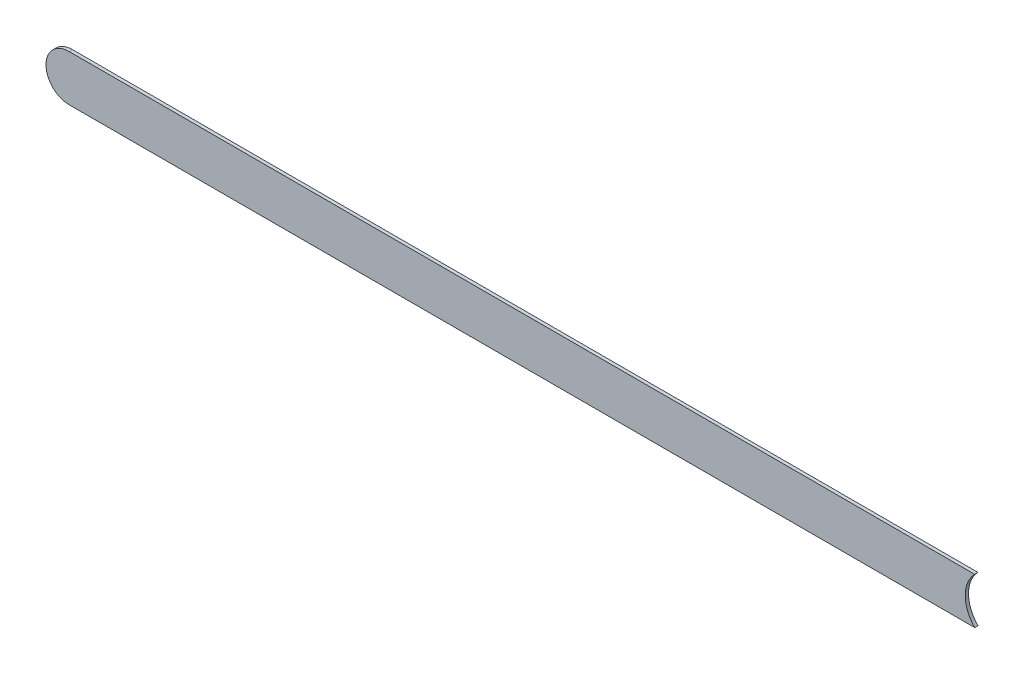
ISO-10303-21;
HEADER;
FILE_DESCRIPTION(('STEP AP214'),'2;1');
FILE_NAME('part.step','',(''),(''),'','','');
FILE_SCHEMA(('AUTOMOTIVE_DESIGN { 1 0 10303 214 1 1 1 1 }'));
ENDSEC;
DATA;
#1=APPLICATION_CONTEXT('core data for automotive mechanical design processes');
#2=APPLICATION_PROTOCOL_DEFINITION('international standard','automotive_design',2000,#1);
#3=PRODUCT_CONTEXT('',#1,'mechanical');
#4=PRODUCT('Part','Part','',(#3));
#5=PRODUCT_RELATED_PRODUCT_CATEGORY('part','',(#4));
#6=PRODUCT_DEFINITION_FORMATION('','',#4);
#7=PRODUCT_DEFINITION_CONTEXT('part definition',#1,'design');
#8=PRODUCT_DEFINITION('design','',#6,#7);
#9=PRODUCT_DEFINITION_SHAPE('','',#8);
#10=(LENGTH_UNIT() NAMED_UNIT(*) SI_UNIT(.MILLI.,.METRE.));
#11=(NAMED_UNIT(*) PLANE_ANGLE_UNIT() SI_UNIT($,.RADIAN.));
#12=(NAMED_UNIT(*) SI_UNIT($,.STERADIAN.) SOLID_ANGLE_UNIT());
#13=UNCERTAINTY_MEASURE_WITH_UNIT(LENGTH_MEASURE(1.E-05),#10,'distance_accuracy_value','');
#14=(GEOMETRIC_REPRESENTATION_CONTEXT(3) GLOBAL_UNCERTAINTY_ASSIGNED_CONTEXT((#13)) GLOBAL_UNIT_ASSIGNED_CONTEXT((#10,
#11,#12)) REPRESENTATION_CONTEXT('',''));
#15=CARTESIAN_POINT('',(0.,0.,0.));
#16=DIRECTION('',(0.,0.,1.));
#17=DIRECTION('',(1.,0.,0.));
#18=AXIS2_PLACEMENT_3D('',#15,#16,#17);
#19=CARTESIAN_POINT('',(77.83368482,111.75000002,0.));
#20=DIRECTION('',(0.,1.,0.));
#21=DIRECTION('',(1.,0.,0.));
#22=AXIS2_PLACEMENT_3D('',#19,#20,#21);
#23=PLANE('',#22);
#24=DIRECTION('',(1.,0.,0.));
#25=VECTOR('',#24,1.);
#26=CARTESIAN_POINT('',(77.83368482,111.75000002,0.03556));
#27=LINE('',#26,#25);
#28=CARTESIAN_POINT('',(77.83368482,111.75000002,0.03556));
#29=VERTEX_POINT('',#28);
#30=CARTESIAN_POINT('',(87.6471129044069,111.75000002,0.03556));
#31=VERTEX_POINT('',#30);
#32=EDGE_CURVE('E11',#29,#31,#27,.T.);
#33=ORIENTED_EDGE('',*,*,#32,.F.);
#34=DIRECTION('',(0.,0.,1.));
#35=VECTOR('',#34,1.);
#36=CARTESIAN_POINT('',(77.83368482,111.75000002,0.));
#37=LINE('',#36,#35);
#38=CARTESIAN_POINT('',(77.83368482,111.75000002,0.));
#39=VERTEX_POINT('',#38);
#40=EDGE_CURVE('E24',#39,#29,#37,.T.);
#41=ORIENTED_EDGE('',*,*,#40,.F.);
#42=DIRECTION('',(1.,0.,0.));
#43=VECTOR('',#42,1.);
#44=CARTESIAN_POINT('',(77.83368482,111.75000002,0.));
#45=LINE('',#44,#43);
#46=CARTESIAN_POINT('',(87.6471129044069,111.75000002,0.));
#47=VERTEX_POINT('',#46);
#48=EDGE_CURVE('E75',#39,#47,#45,.T.);
#49=ORIENTED_EDGE('',*,*,#48,.T.);
#50=DIRECTION('',(0.,0.,1.));
#51=VECTOR('',#50,1.);
#52=CARTESIAN_POINT('',(87.6471129044069,111.75000002,0.));
#53=LINE('',#52,#51);
#54=EDGE_CURVE('E37',#47,#31,#53,.T.);
#55=ORIENTED_EDGE('',*,*,#54,.T.);
#56=EDGE_LOOP('',(#33,#41,#49,#55));
#57=FACE_BOUND('',#56,.T.);
#58=ADVANCED_FACE('F17',(#57),#23,.F.);
#59=CARTESIAN_POINT('',(87.89999946,111.99999952,0.));
#60=DIRECTION('',(0.,0.,-1.));
#61=DIRECTION('',(1.,0.,0.));
#62=AXIS2_PLACEMENT_3D('',#59,#60,#61);
#63=CYLINDRICAL_SURFACE('',#62,0.3556);
#64=DIRECTION('',(0.,0.,1.));
#65=VECTOR('',#64,1.);
#66=CARTESIAN_POINT('',(87.6471129044069,112.24999902,0.));
#67=LINE('',#66,#65);
#68=CARTESIAN_POINT('',(87.6471129044069,112.24999902,0.));
#69=VERTEX_POINT('',#68);
#70=CARTESIAN_POINT('',(87.6471129044069,112.24999902,0.03556));
#71=VERTEX_POINT('',#70);
#72=EDGE_CURVE('E67',#69,#71,#67,.T.);
#73=ORIENTED_EDGE('',*,*,#72,.T.);
#74=CARTESIAN_POINT('',(87.89999946,111.99999952,0.03556));
#75=DIRECTION('',(0.,0.,1.));
#76=DIRECTION('',(1.,0.,0.));
#77=AXIS2_PLACEMENT_3D('',#74,#75,#76);
#78=CIRCLE('',#77,0.3556);
#79=EDGE_CURVE('E82',#71,#31,#78,.T.);
#80=ORIENTED_EDGE('',*,*,#79,.T.);
#81=ORIENTED_EDGE('',*,*,#54,.F.);
#82=CARTESIAN_POINT('',(87.89999946,111.99999952,0.));
#83=DIRECTION('',(0.,0.,1.));
#84=DIRECTION('',(1.,0.,0.));
#85=AXIS2_PLACEMENT_3D('',#82,#83,#84);
#86=CIRCLE('',#85,0.3556);
#87=EDGE_CURVE('E80',#69,#47,#86,.T.);
#88=ORIENTED_EDGE('',*,*,#87,.F.);
#89=EDGE_LOOP('',(#73,#80,#81,#88));
#90=FACE_BOUND('',#89,.T.);
#91=ADVANCED_FACE('F88',(#90),#63,.F.);
#92=CARTESIAN_POINT('',(87.6471129044069,112.24999902,0.));
#93=DIRECTION('',(0.,-1.,0.));
#94=DIRECTION('',(-1.,0.,0.));
#95=AXIS2_PLACEMENT_3D('',#92,#93,#94);
#96=PLANE('',#95);
#97=DIRECTION('',(-1.,0.,0.));
#98=VECTOR('',#97,1.);
#99=CARTESIAN_POINT('',(87.89999946,112.24999902,0.03556));
#100=LINE('',#99,#98);
#101=CARTESIAN_POINT('',(77.83368482,112.24999902,0.03556));
#102=VERTEX_POINT('',#101);
#103=EDGE_CURVE('E71',#71,#102,#100,.T.);
#104=ORIENTED_EDGE('',*,*,#103,.F.);
#105=ORIENTED_EDGE('',*,*,#72,.F.);
#106=DIRECTION('',(-1.,0.,0.));
#107=VECTOR('',#106,1.);
#108=CARTESIAN_POINT('',(87.89999946,112.24999902,0.));
#109=LINE('',#108,#107);
#110=CARTESIAN_POINT('',(77.83368482,112.24999902,0.));
#111=VERTEX_POINT('',#110);
#112=EDGE_CURVE('E63',#69,#111,#109,.T.);
#113=ORIENTED_EDGE('',*,*,#112,.T.);
#114=DIRECTION('',(0.,0.,1.));
#115=VECTOR('',#114,1.);
#116=CARTESIAN_POINT('',(77.83368482,112.24999902,0.));
#117=LINE('',#116,#115);
#118=EDGE_CURVE('E53',#111,#102,#117,.T.);
#119=ORIENTED_EDGE('',*,*,#118,.T.);
#120=EDGE_LOOP('',(#104,#105,#113,#119));
#121=FACE_BOUND('',#120,.T.);
#122=ADVANCED_FACE('F66',(#121),#96,.F.);
#123=CARTESIAN_POINT('',(77.83368482,111.99999952,0.));
#124=DIRECTION('',(0.,0.,-1.));
#125=DIRECTION('',(0.,1.,0.));
#126=AXIS2_PLACEMENT_3D('',#123,#124,#125);
#127=CYLINDRICAL_SURFACE('',#126,0.249999500000001);
#128=CARTESIAN_POINT('',(77.83368482,111.99999952,0.03556));
#129=DIRECTION('',(0.,0.,1.));
#130=DIRECTION('',(0.,1.,0.));
#131=AXIS2_PLACEMENT_3D('',#128,#129,#130);
#132=CIRCLE('',#131,0.249999500000001);
#133=EDGE_CURVE('E59',#102,#29,#132,.T.);
#134=ORIENTED_EDGE('',*,*,#133,.F.);
#135=ORIENTED_EDGE('',*,*,#118,.F.);
#136=CARTESIAN_POINT('',(77.83368482,111.99999952,0.));
#137=DIRECTION('',(0.,0.,1.));
#138=DIRECTION('',(0.,1.,0.));
#139=AXIS2_PLACEMENT_3D('',#136,#137,#138);
#140=CIRCLE('',#139,0.249999500000001);
#141=EDGE_CURVE('E57',#111,#39,#140,.T.);
#142=ORIENTED_EDGE('',*,*,#141,.T.);
#143=ORIENTED_EDGE('',*,*,#40,.T.);
#144=EDGE_LOOP('',(#134,#135,#142,#143));
#145=FACE_BOUND('',#144,.T.);
#146=ADVANCED_FACE('F55',(#145),#127,.T.);
#147=CARTESIAN_POINT('',(77.83368482,111.75000002,0.));
#148=DIRECTION('',(0.,0.,-1.));
#149=DIRECTION('',(-1.,0.,0.));
#150=AXIS2_PLACEMENT_3D('',#147,#148,#149);
#151=PLANE('',#150);
#152=ORIENTED_EDGE('',*,*,#48,.F.);
#153=ORIENTED_EDGE('',*,*,#141,.F.);
#154=ORIENTED_EDGE('',*,*,#112,.F.);
#155=ORIENTED_EDGE('',*,*,#87,.T.);
#156=EDGE_LOOP('',(#152,#153,#154,#155));
#157=FACE_BOUND('',#156,.T.);
#158=ADVANCED_FACE('F74',(#157),#151,.T.);
#159=CARTESIAN_POINT('',(77.83368482,111.75000002,0.03556));
#160=DIRECTION('',(0.,0.,-1.));
#161=DIRECTION('',(-1.,0.,0.));
#162=AXIS2_PLACEMENT_3D('',#159,#160,#161);
#163=PLANE('',#162);
#164=ORIENTED_EDGE('',*,*,#133,.T.);
#165=ORIENTED_EDGE('',*,*,#32,.T.);
#166=ORIENTED_EDGE('',*,*,#79,.F.);
#167=ORIENTED_EDGE('',*,*,#103,.T.);
#168=EDGE_LOOP('',(#164,#165,#166,#167));
#169=FACE_BOUND('',#168,.T.);
#170=ADVANCED_FACE('F91',(#169),#163,.F.);
#171=CLOSED_SHELL('',(#58,#91,#122,#146,#158,#170));
#172=MANIFOLD_SOLID_BREP('B1',#171);
#173=ADVANCED_BREP_SHAPE_REPRESENTATION('',(#18,#172),#14);
#174=SHAPE_DEFINITION_REPRESENTATION(#9,#173);
ENDSEC;
END-ISO-10303-21;
